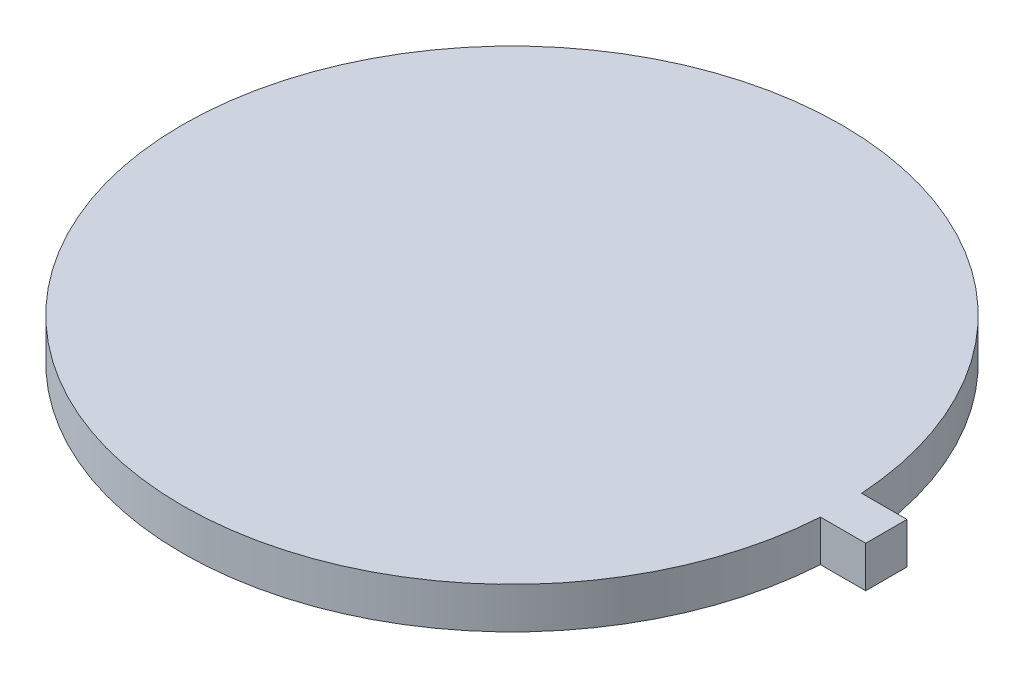
ISO-10303-21;
HEADER;
FILE_DESCRIPTION(('STEP AP214'),'2;1');
FILE_NAME('part.step','',(''),(''),'','','');
FILE_SCHEMA(('AUTOMOTIVE_DESIGN { 1 0 10303 214 1 1 1 1 }'));
ENDSEC;
DATA;
#1=APPLICATION_CONTEXT('core data for automotive mechanical design processes');
#2=APPLICATION_PROTOCOL_DEFINITION('international standard','automotive_design',2000,#1);
#3=PRODUCT_CONTEXT('',#1,'mechanical');
#4=PRODUCT('Part','Part','',(#3));
#5=PRODUCT_RELATED_PRODUCT_CATEGORY('part','',(#4));
#6=PRODUCT_DEFINITION_FORMATION('','',#4);
#7=PRODUCT_DEFINITION_CONTEXT('part definition',#1,'design');
#8=PRODUCT_DEFINITION('design','',#6,#7);
#9=PRODUCT_DEFINITION_SHAPE('','',#8);
#10=(LENGTH_UNIT() NAMED_UNIT(*) SI_UNIT(.MILLI.,.METRE.));
#11=(NAMED_UNIT(*) PLANE_ANGLE_UNIT() SI_UNIT($,.RADIAN.));
#12=(NAMED_UNIT(*) SI_UNIT($,.STERADIAN.) SOLID_ANGLE_UNIT());
#13=UNCERTAINTY_MEASURE_WITH_UNIT(LENGTH_MEASURE(1.E-05),#10,'distance_accuracy_value','');
#14=(GEOMETRIC_REPRESENTATION_CONTEXT(3) GLOBAL_UNCERTAINTY_ASSIGNED_CONTEXT((#13)) GLOBAL_UNIT_ASSIGNED_CONTEXT((#10,
#11,#12)) REPRESENTATION_CONTEXT('',''));
#15=CARTESIAN_POINT('',(0.,0.,0.));
#16=DIRECTION('',(0.,0.,1.));
#17=DIRECTION('',(1.,0.,0.));
#18=AXIS2_PLACEMENT_3D('',#15,#16,#17);
#19=CARTESIAN_POINT('',(115.371368333963,12.7,3.17500000000013));
#20=DIRECTION('',(-1.,0.,0.));
#21=DIRECTION('',(0.,0.,1.));
#22=AXIS2_PLACEMENT_3D('',#19,#20,#21);
#23=PLANE('',#22);
#24=DIRECTION('',(0.,0.,-1.));
#25=VECTOR('',#24,1.);
#26=CARTESIAN_POINT('',(115.371368333963,0.,3.17500000000013));
#27=LINE('',#26,#25);
#28=CARTESIAN_POINT('',(115.371368333963,0.,6.35));
#29=VERTEX_POINT('',#28);
#30=CARTESIAN_POINT('',(115.371368333963,0.,-6.35));
#31=VERTEX_POINT('',#30);
#32=EDGE_CURVE('E86',#29,#31,#27,.T.);
#33=ORIENTED_EDGE('',*,*,#32,.T.);
#34=DIRECTION('',(0.,-1.,0.));
#35=VECTOR('',#34,1.);
#36=CARTESIAN_POINT('',(115.371368333963,12.7,-6.35));
#37=LINE('',#36,#35);
#38=CARTESIAN_POINT('',(115.371368333963,12.7,-6.35));
#39=VERTEX_POINT('',#38);
#40=EDGE_CURVE('E11',#39,#31,#37,.T.);
#41=ORIENTED_EDGE('',*,*,#40,.F.);
#42=DIRECTION('',(0.,0.,-1.));
#43=VECTOR('',#42,1.);
#44=CARTESIAN_POINT('',(115.371368333963,12.7,3.17500000000013));
#45=LINE('',#44,#43);
#46=CARTESIAN_POINT('',(115.371368333963,12.7,6.35));
#47=VERTEX_POINT('',#46);
#48=EDGE_CURVE('E91',#47,#39,#45,.T.);
#49=ORIENTED_EDGE('',*,*,#48,.F.);
#50=DIRECTION('',(0.,-1.,0.));
#51=VECTOR('',#50,1.);
#52=CARTESIAN_POINT('',(115.371368333963,12.7,6.35));
#53=LINE('',#52,#51);
#54=EDGE_CURVE('E110',#47,#29,#53,.T.);
#55=ORIENTED_EDGE('',*,*,#54,.T.);
#56=EDGE_LOOP('',(#33,#41,#49,#55));
#57=FACE_BOUND('',#56,.T.);
#58=ADVANCED_FACE('F45',(#57),#23,.F.);
#59=CARTESIAN_POINT('',(115.371368333963,12.7,-6.35));
#60=DIRECTION('',(0.,0.,1.));
#61=DIRECTION('',(1.,0.,0.));
#62=AXIS2_PLACEMENT_3D('',#59,#60,#61);
#63=PLANE('',#62);
#64=DIRECTION('',(-1.,0.,0.));
#65=VECTOR('',#64,1.);
#66=CARTESIAN_POINT('',(115.371368333963,0.,-6.35));
#67=LINE('',#66,#65);
#68=CARTESIAN_POINT('',(101.401368333963,0.,-6.35));
#69=VERTEX_POINT('',#68);
#70=EDGE_CURVE('E103',#31,#69,#67,.T.);
#71=ORIENTED_EDGE('',*,*,#70,.T.);
#72=DIRECTION('',(0.,-1.,0.));
#73=VECTOR('',#72,1.);
#74=CARTESIAN_POINT('',(101.401368333963,12.7,-6.35));
#75=LINE('',#74,#73);
#76=CARTESIAN_POINT('',(101.401368333963,12.7,-6.35));
#77=VERTEX_POINT('',#76);
#78=EDGE_CURVE('E54',#77,#69,#75,.T.);
#79=ORIENTED_EDGE('',*,*,#78,.F.);
#80=DIRECTION('',(-1.,0.,0.));
#81=VECTOR('',#80,1.);
#82=CARTESIAN_POINT('',(115.371368333963,12.7,-6.35));
#83=LINE('',#82,#81);
#84=EDGE_CURVE('E94',#39,#77,#83,.T.);
#85=ORIENTED_EDGE('',*,*,#84,.F.);
#86=ORIENTED_EDGE('',*,*,#40,.T.);
#87=EDGE_LOOP('',(#71,#79,#85,#86));
#88=FACE_BOUND('',#87,.T.);
#89=ADVANCED_FACE('F102',(#88),#63,.F.);
#90=CARTESIAN_POINT('',(0.,12.7,0.));
#91=DIRECTION('',(0.,-1.,0.));
#92=DIRECTION('',(0.,0.,-1.));
#93=AXIS2_PLACEMENT_3D('',#90,#91,#92);
#94=CYLINDRICAL_SURFACE('',#93,101.6);
#95=CARTESIAN_POINT('',(0.,0.,0.));
#96=DIRECTION('',(0.,1.,0.));
#97=DIRECTION('',(0.,0.,1.));
#98=AXIS2_PLACEMENT_3D('',#95,#96,#97);
#99=CIRCLE('',#98,101.6);
#100=CARTESIAN_POINT('',(101.401368333963,0.,6.34999999999997));
#101=VERTEX_POINT('',#100);
#102=EDGE_CURVE('E79',#69,#101,#99,.T.);
#103=ORIENTED_EDGE('',*,*,#102,.T.);
#104=DIRECTION('',(0.,-1.,0.));
#105=VECTOR('',#104,1.);
#106=CARTESIAN_POINT('',(101.401368333963,12.7,6.34999999999997));
#107=LINE('',#106,#105);
#108=CARTESIAN_POINT('',(101.401368333963,12.7,6.34999999999997));
#109=VERTEX_POINT('',#108);
#110=EDGE_CURVE('E105',#109,#101,#107,.T.);
#111=ORIENTED_EDGE('',*,*,#110,.F.);
#112=CARTESIAN_POINT('',(0.,12.7,0.));
#113=DIRECTION('',(0.,1.,0.));
#114=DIRECTION('',(0.,0.,1.));
#115=AXIS2_PLACEMENT_3D('',#112,#113,#114);
#116=CIRCLE('',#115,101.6);
#117=EDGE_CURVE('E98',#77,#109,#116,.T.);
#118=ORIENTED_EDGE('',*,*,#117,.F.);
#119=ORIENTED_EDGE('',*,*,#78,.T.);
#120=EDGE_LOOP('',(#103,#111,#118,#119));
#121=FACE_BOUND('',#120,.T.);
#122=ADVANCED_FACE('F106',(#121),#94,.T.);
#123=CARTESIAN_POINT('',(115.371368333963,12.7,6.35));
#124=DIRECTION('',(0.,0.,-1.));
#125=DIRECTION('',(-1.,0.,0.));
#126=AXIS2_PLACEMENT_3D('',#123,#124,#125);
#127=PLANE('',#126);
#128=DIRECTION('',(1.,0.,0.));
#129=VECTOR('',#128,1.);
#130=CARTESIAN_POINT('',(115.371368333963,0.,6.35));
#131=LINE('',#130,#129);
#132=EDGE_CURVE('E120',#101,#29,#131,.T.);
#133=ORIENTED_EDGE('',*,*,#132,.T.);
#134=ORIENTED_EDGE('',*,*,#54,.F.);
#135=DIRECTION('',(1.,0.,0.));
#136=VECTOR('',#135,1.);
#137=CARTESIAN_POINT('',(115.371368333963,12.7,6.35));
#138=LINE('',#137,#136);
#139=EDGE_CURVE('E62',#109,#47,#138,.T.);
#140=ORIENTED_EDGE('',*,*,#139,.F.);
#141=ORIENTED_EDGE('',*,*,#110,.T.);
#142=EDGE_LOOP('',(#133,#134,#140,#141));
#143=FACE_BOUND('',#142,.T.);
#144=ADVANCED_FACE('F128',(#143),#127,.F.);
#145=CARTESIAN_POINT('',(0.,12.7,0.));
#146=DIRECTION('',(0.,1.,0.));
#147=DIRECTION('',(0.,0.,1.));
#148=AXIS2_PLACEMENT_3D('',#145,#146,#147);
#149=PLANE('',#148);
#150=ORIENTED_EDGE('',*,*,#48,.T.);
#151=ORIENTED_EDGE('',*,*,#84,.T.);
#152=ORIENTED_EDGE('',*,*,#117,.T.);
#153=ORIENTED_EDGE('',*,*,#139,.T.);
#154=EDGE_LOOP('',(#150,#151,#152,#153));
#155=FACE_BOUND('',#154,.T.);
#156=ADVANCED_FACE('F96',(#155),#149,.T.);
#157=CARTESIAN_POINT('',(0.,0.,0.));
#158=DIRECTION('',(0.,1.,0.));
#159=DIRECTION('',(0.,0.,1.));
#160=AXIS2_PLACEMENT_3D('',#157,#158,#159);
#161=PLANE('',#160);
#162=ORIENTED_EDGE('',*,*,#32,.F.);
#163=ORIENTED_EDGE('',*,*,#132,.F.);
#164=ORIENTED_EDGE('',*,*,#102,.F.);
#165=ORIENTED_EDGE('',*,*,#70,.F.);
#166=EDGE_LOOP('',(#162,#163,#164,#165));
#167=FACE_BOUND('',#166,.T.);
#168=ADVANCED_FACE('F129',(#167),#161,.F.);
#169=CLOSED_SHELL('',(#58,#89,#122,#144,#156,#168));
#170=MANIFOLD_SOLID_BREP('B2',#169);
#171=ADVANCED_BREP_SHAPE_REPRESENTATION('',(#18,#170),#14);
#172=SHAPE_DEFINITION_REPRESENTATION(#9,#171);
ENDSEC;
END-ISO-10303-21;
